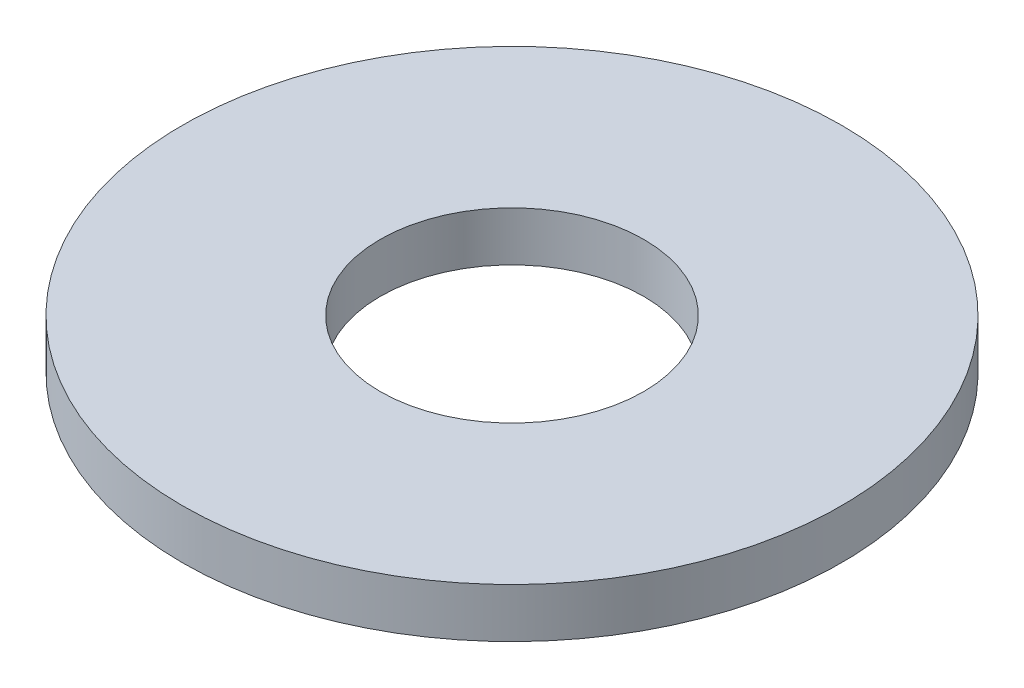
ISO-10303-21;
HEADER;
FILE_DESCRIPTION(('STEP AP214'),'2;1');
FILE_NAME('part.step','',(''),(''),'','','');
FILE_SCHEMA(('AUTOMOTIVE_DESIGN { 1 0 10303 214 1 1 1 1 }'));
ENDSEC;
DATA;
#1=APPLICATION_CONTEXT('core data for automotive mechanical design processes');
#2=APPLICATION_PROTOCOL_DEFINITION('international standard','automotive_design',2000,#1);
#3=PRODUCT_CONTEXT('',#1,'mechanical');
#4=PRODUCT('Part','Part','',(#3));
#5=PRODUCT_RELATED_PRODUCT_CATEGORY('part','',(#4));
#6=PRODUCT_DEFINITION_FORMATION('','',#4);
#7=PRODUCT_DEFINITION_CONTEXT('part definition',#1,'design');
#8=PRODUCT_DEFINITION('design','',#6,#7);
#9=PRODUCT_DEFINITION_SHAPE('','',#8);
#10=(LENGTH_UNIT() NAMED_UNIT(*) SI_UNIT(.MILLI.,.METRE.));
#11=(NAMED_UNIT(*) PLANE_ANGLE_UNIT() SI_UNIT($,.RADIAN.));
#12=(NAMED_UNIT(*) SI_UNIT($,.STERADIAN.) SOLID_ANGLE_UNIT());
#13=UNCERTAINTY_MEASURE_WITH_UNIT(LENGTH_MEASURE(1.E-05),#10,'distance_accuracy_value','');
#14=(GEOMETRIC_REPRESENTATION_CONTEXT(3) GLOBAL_UNCERTAINTY_ASSIGNED_CONTEXT((#13)) GLOBAL_UNIT_ASSIGNED_CONTEXT((#10,
#11,#12)) REPRESENTATION_CONTEXT('',''));
#15=CARTESIAN_POINT('',(0.,0.,0.));
#16=DIRECTION('',(0.,0.,1.));
#17=DIRECTION('',(1.,0.,0.));
#18=AXIS2_PLACEMENT_3D('',#15,#16,#17);
#19=CARTESIAN_POINT('',(0.,0.75,0.));
#20=DIRECTION('',(0.,1.,0.));
#21=DIRECTION('',(0.,0.,1.));
#22=AXIS2_PLACEMENT_3D('',#19,#20,#21);
#23=PLANE('',#22);
#24=CARTESIAN_POINT('',(0.,0.75,0.));
#25=DIRECTION('',(0.,1.,0.));
#26=DIRECTION('',(0.,0.,1.));
#27=AXIS2_PLACEMENT_3D('',#24,#25,#26);
#28=CIRCLE('',#27,5.);
#29=CARTESIAN_POINT('',(0.,0.75,5.));
#30=VERTEX_POINT('',#29);
#31=EDGE_CURVE('E10',#30,#30,#28,.T.);
#32=ORIENTED_EDGE('',*,*,#31,.T.);
#33=EDGE_LOOP('',(#32));
#34=FACE_BOUND('',#33,.T.);
#35=CARTESIAN_POINT('',(0.,0.75,0.));
#36=DIRECTION('',(0.,1.,0.));
#37=DIRECTION('',(0.,0.,1.));
#38=AXIS2_PLACEMENT_3D('',#35,#36,#37);
#39=CIRCLE('',#38,2.);
#40=CARTESIAN_POINT('',(0.,0.75,2.));
#41=VERTEX_POINT('',#40);
#42=EDGE_CURVE('E48',#41,#41,#39,.T.);
#43=ORIENTED_EDGE('',*,*,#42,.F.);
#44=EDGE_LOOP('',(#43));
#45=FACE_BOUND('',#44,.T.);
#46=ADVANCED_FACE('F37',(#34,#45),#23,.T.);
#47=CARTESIAN_POINT('',(0.,0.,0.));
#48=DIRECTION('',(0.,1.,0.));
#49=DIRECTION('',(0.,0.,1.));
#50=AXIS2_PLACEMENT_3D('',#47,#48,#49);
#51=PLANE('',#50);
#52=CARTESIAN_POINT('',(0.,0.,0.));
#53=DIRECTION('',(0.,1.,0.));
#54=DIRECTION('',(0.,0.,1.));
#55=AXIS2_PLACEMENT_3D('',#52,#53,#54);
#56=CIRCLE('',#55,5.);
#57=CARTESIAN_POINT('',(0.,0.,5.));
#58=VERTEX_POINT('',#57);
#59=EDGE_CURVE('E41',#58,#58,#56,.T.);
#60=ORIENTED_EDGE('',*,*,#59,.F.);
#61=EDGE_LOOP('',(#60));
#62=FACE_BOUND('',#61,.T.);
#63=CARTESIAN_POINT('',(0.,0.,0.));
#64=DIRECTION('',(0.,1.,0.));
#65=DIRECTION('',(0.,0.,1.));
#66=AXIS2_PLACEMENT_3D('',#63,#64,#65);
#67=CIRCLE('',#66,2.);
#68=CARTESIAN_POINT('',(0.,0.,2.));
#69=VERTEX_POINT('',#68);
#70=EDGE_CURVE('E50',#69,#69,#67,.T.);
#71=ORIENTED_EDGE('',*,*,#70,.T.);
#72=EDGE_LOOP('',(#71));
#73=FACE_BOUND('',#72,.T.);
#74=ADVANCED_FACE('F60',(#62,#73),#51,.F.);
#75=CARTESIAN_POINT('',(0.,0.75,0.));
#76=DIRECTION('',(0.,-1.,0.));
#77=DIRECTION('',(0.,0.,-1.));
#78=AXIS2_PLACEMENT_3D('',#75,#76,#77);
#79=CYLINDRICAL_SURFACE('',#78,5.);
#80=ORIENTED_EDGE('',*,*,#31,.F.);
#81=EDGE_LOOP('',(#80));
#82=FACE_BOUND('',#81,.T.);
#83=ORIENTED_EDGE('',*,*,#59,.T.);
#84=EDGE_LOOP('',(#83));
#85=FACE_BOUND('',#84,.T.);
#86=ADVANCED_FACE('F39',(#82,#85),#79,.T.);
#87=CARTESIAN_POINT('',(0.,0.75,0.));
#88=DIRECTION('',(0.,-1.,0.));
#89=DIRECTION('',(0.,0.,-1.));
#90=AXIS2_PLACEMENT_3D('',#87,#88,#89);
#91=CYLINDRICAL_SURFACE('',#90,2.);
#92=ORIENTED_EDGE('',*,*,#42,.T.);
#93=EDGE_LOOP('',(#92));
#94=FACE_BOUND('',#93,.T.);
#95=ORIENTED_EDGE('',*,*,#70,.F.);
#96=EDGE_LOOP('',(#95));
#97=FACE_BOUND('',#96,.T.);
#98=ADVANCED_FACE('F56',(#94,#97),#91,.F.);
#99=CLOSED_SHELL('',(#46,#74,#86,#98));
#100=MANIFOLD_SOLID_BREP('B2',#99);
#101=ADVANCED_BREP_SHAPE_REPRESENTATION('',(#18,#100),#14);
#102=SHAPE_DEFINITION_REPRESENTATION(#9,#101);
ENDSEC;
END-ISO-10303-21;
